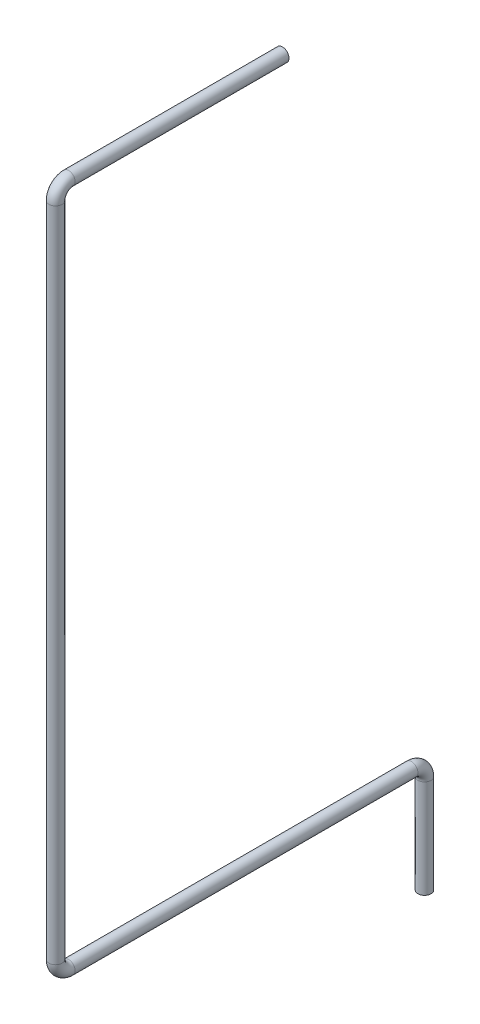
ISO-10303-21;
HEADER;
FILE_DESCRIPTION(('STEP AP214'),'2;1');
FILE_NAME('part.step','',(''),(''),'','','');
FILE_SCHEMA(('AUTOMOTIVE_DESIGN { 1 0 10303 214 1 1 1 1 }'));
ENDSEC;
DATA;
#1=APPLICATION_CONTEXT('core data for automotive mechanical design processes');
#2=APPLICATION_PROTOCOL_DEFINITION('international standard','automotive_design',2000,#1);
#3=PRODUCT_CONTEXT('',#1,'mechanical');
#4=PRODUCT('Part','Part','',(#3));
#5=PRODUCT_RELATED_PRODUCT_CATEGORY('part','',(#4));
#6=PRODUCT_DEFINITION_FORMATION('','',#4);
#7=PRODUCT_DEFINITION_CONTEXT('part definition',#1,'design');
#8=PRODUCT_DEFINITION('design','',#6,#7);
#9=PRODUCT_DEFINITION_SHAPE('','',#8);
#10=(LENGTH_UNIT() NAMED_UNIT(*) SI_UNIT(.MILLI.,.METRE.));
#11=(NAMED_UNIT(*) PLANE_ANGLE_UNIT() SI_UNIT($,.RADIAN.));
#12=(NAMED_UNIT(*) SI_UNIT($,.STERADIAN.) SOLID_ANGLE_UNIT());
#13=UNCERTAINTY_MEASURE_WITH_UNIT(LENGTH_MEASURE(1.E-05),#10,'distance_accuracy_value','');
#14=(GEOMETRIC_REPRESENTATION_CONTEXT(3) GLOBAL_UNCERTAINTY_ASSIGNED_CONTEXT((#13)) GLOBAL_UNIT_ASSIGNED_CONTEXT((#10,
#11,#12)) REPRESENTATION_CONTEXT('',''));
#15=CARTESIAN_POINT('',(0.,0.,0.));
#16=DIRECTION('',(0.,0.,1.));
#17=DIRECTION('',(1.,0.,0.));
#18=AXIS2_PLACEMENT_3D('',#15,#16,#17);
#19=CARTESIAN_POINT('',(0.,0.,0.));
#20=DIRECTION('',(0.,0.,-1.));
#21=DIRECTION('',(0.,1.,0.));
#22=AXIS2_PLACEMENT_3D('',#19,#20,#21);
#23=PLANE('',#22);
#24=CARTESIAN_POINT('',(0.,0.,0.));
#25=DIRECTION('',(0.,0.,-1.));
#26=DIRECTION('',(0.,1.,0.));
#27=AXIS2_PLACEMENT_3D('',#24,#25,#26);
#28=CIRCLE('',#27,1.);
#29=CARTESIAN_POINT('',(0.,1.,0.));
#30=VERTEX_POINT('',#29);
#31=EDGE_CURVE('E79',#30,#30,#28,.T.);
#32=ORIENTED_EDGE('',*,*,#31,.T.);
#33=EDGE_LOOP('',(#32));
#34=FACE_BOUND('',#33,.T.);
#35=ADVANCED_FACE('F51',(#34),#23,.T.);
#36=CARTESIAN_POINT('',(0.,-121.36,-21.69));
#37=DIRECTION('',(0.,1.,0.));
#38=DIRECTION('',(0.,0.,1.));
#39=AXIS2_PLACEMENT_3D('',#36,#37,#38);
#40=PLANE('',#39);
#41=CARTESIAN_POINT('',(0.,-121.36,-21.69));
#42=DIRECTION('',(0.,1.,0.));
#43=DIRECTION('',(0.,0.,1.));
#44=AXIS2_PLACEMENT_3D('',#41,#42,#43);
#45=CIRCLE('',#44,1.);
#46=CARTESIAN_POINT('',(0.,-121.36,-20.69));
#47=VERTEX_POINT('',#46);
#48=EDGE_CURVE('E11',#47,#47,#45,.T.);
#49=ORIENTED_EDGE('',*,*,#48,.F.);
#50=EDGE_LOOP('',(#49));
#51=FACE_BOUND('',#50,.T.);
#52=ADVANCED_FACE('F87',(#51),#40,.F.);
#53=CARTESIAN_POINT('',(0.,0.,0.));
#54=DIRECTION('',(0.,0.,1.));
#55=DIRECTION('',(0.,-1.,0.));
#56=AXIS2_PLACEMENT_3D('',#53,#54,#55);
#57=CYLINDRICAL_SURFACE('',#56,1.);
#58=CARTESIAN_POINT('',(0.,0.,32.66));
#59=DIRECTION('',(0.,0.,-1.));
#60=DIRECTION('',(0.,1.,0.));
#61=AXIS2_PLACEMENT_3D('',#58,#59,#60);
#62=CIRCLE('',#61,1.);
#63=CARTESIAN_POINT('',(0.,0.999999999999997,32.66));
#64=VERTEX_POINT('',#63);
#65=EDGE_CURVE('E76',#64,#64,#62,.T.);
#66=ORIENTED_EDGE('',*,*,#65,.T.);
#67=EDGE_LOOP('',(#66));
#68=FACE_BOUND('',#67,.T.);
#69=ORIENTED_EDGE('',*,*,#31,.F.);
#70=EDGE_LOOP('',(#69));
#71=FACE_BOUND('',#70,.T.);
#72=ADVANCED_FACE('F84',(#68,#71),#57,.T.);
#73=CARTESIAN_POINT('',(0.,-2.,32.66));
#74=DIRECTION('',(1.,0.,0.));
#75=DIRECTION('',(0.,0.,-1.));
#76=AXIS2_PLACEMENT_3D('',#73,#74,#75);
#77=TOROIDAL_SURFACE('',#76,2.,1.);
#78=CARTESIAN_POINT('',(0.,-2.,34.66));
#79=DIRECTION('',(0.,1.,0.));
#80=DIRECTION('',(0.,0.,1.));
#81=AXIS2_PLACEMENT_3D('',#78,#79,#80);
#82=CIRCLE('',#81,1.);
#83=CARTESIAN_POINT('',(0.,-2.,35.66));
#84=VERTEX_POINT('',#83);
#85=EDGE_CURVE('E73',#84,#84,#82,.T.);
#86=CARTESIAN_POINT('',(0.,-2.,32.66));
#87=DIRECTION('',(1.,0.,0.));
#88=DIRECTION('',(0.,0.,-1.));
#89=AXIS2_PLACEMENT_3D('',#86,#87,#88);
#90=CIRCLE('',#89,3.);
#91=EDGE_CURVE('',#64,#84,#90,.T.);
#92=ORIENTED_EDGE('',*,*,#65,.F.);
#93=ORIENTED_EDGE('',*,*,#85,.T.);
#94=ORIENTED_EDGE('',*,*,#91,.T.);
#95=ORIENTED_EDGE('',*,*,#91,.F.);
#96=EDGE_LOOP('',(#92,#94,#93,#95));
#97=FACE_BOUND('',#96,.T.);
#98=ADVANCED_FACE('F86',(#97),#77,.T.);
#99=CARTESIAN_POINT('',(0.,-2.00000000000002,34.66));
#100=DIRECTION('',(0.,-1.,0.));
#101=DIRECTION('',(0.,0.,-1.));
#102=AXIS2_PLACEMENT_3D('',#99,#100,#101);
#103=CYLINDRICAL_SURFACE('',#102,1.);
#104=CARTESIAN_POINT('',(0.,-102.36,34.66));
#105=DIRECTION('',(0.,1.,0.));
#106=DIRECTION('',(0.,0.,1.));
#107=AXIS2_PLACEMENT_3D('',#104,#105,#106);
#108=CIRCLE('',#107,1.);
#109=CARTESIAN_POINT('',(0.,-102.36,35.6599999999991));
#110=VERTEX_POINT('',#109);
#111=EDGE_CURVE('E70',#110,#110,#108,.T.);
#112=ORIENTED_EDGE('',*,*,#111,.T.);
#113=EDGE_LOOP('',(#112));
#114=FACE_BOUND('',#113,.T.);
#115=ORIENTED_EDGE('',*,*,#85,.F.);
#116=EDGE_LOOP('',(#115));
#117=FACE_BOUND('',#116,.T.);
#118=ADVANCED_FACE('F94',(#114,#117),#103,.T.);
#119=CARTESIAN_POINT('',(0.,-102.36,32.66));
#120=DIRECTION('',(1.,0.,0.));
#121=DIRECTION('',(0.,0.,-1.));
#122=AXIS2_PLACEMENT_3D('',#119,#120,#121);
#123=TOROIDAL_SURFACE('',#122,1.99999999999913,1.);
#124=CARTESIAN_POINT('',(0.,-104.36,32.66));
#125=DIRECTION('',(0.,0.,1.));
#126=DIRECTION('',(0.,-1.,0.));
#127=AXIS2_PLACEMENT_3D('',#124,#125,#126);
#128=CIRCLE('',#127,1.);
#129=CARTESIAN_POINT('',(0.,-105.359999999999,32.6599999999999));
#130=VERTEX_POINT('',#129);
#131=EDGE_CURVE('E65',#130,#130,#128,.T.);
#132=CARTESIAN_POINT('',(0.,-102.36,32.66));
#133=DIRECTION('',(1.,0.,0.));
#134=DIRECTION('',(0.,0.,-1.));
#135=AXIS2_PLACEMENT_3D('',#132,#133,#134);
#136=CIRCLE('',#135,2.99999999999913);
#137=EDGE_CURVE('',#110,#130,#136,.T.);
#138=ORIENTED_EDGE('',*,*,#111,.F.);
#139=ORIENTED_EDGE('',*,*,#131,.T.);
#140=ORIENTED_EDGE('',*,*,#137,.T.);
#141=ORIENTED_EDGE('',*,*,#137,.F.);
#142=EDGE_LOOP('',(#138,#140,#139,#141));
#143=FACE_BOUND('',#142,.T.);
#144=ADVANCED_FACE('F111',(#143),#123,.T.);
#145=CARTESIAN_POINT('',(0.,-104.36,32.66));
#146=DIRECTION('',(0.,0.,-1.));
#147=DIRECTION('',(-1.,0.,0.));
#148=AXIS2_PLACEMENT_3D('',#145,#146,#147);
#149=CYLINDRICAL_SURFACE('',#148,1.);
#150=CARTESIAN_POINT('',(0.,-104.36,-19.69));
#151=DIRECTION('',(0.,0.,1.));
#152=DIRECTION('',(0.,-1.,0.));
#153=AXIS2_PLACEMENT_3D('',#150,#151,#152);
#154=CIRCLE('',#153,1.);
#155=CARTESIAN_POINT('',(0.,-103.36,-19.69));
#156=VERTEX_POINT('',#155);
#157=EDGE_CURVE('E61',#156,#156,#154,.T.);
#158=ORIENTED_EDGE('',*,*,#157,.T.);
#159=EDGE_LOOP('',(#158));
#160=FACE_BOUND('',#159,.T.);
#161=ORIENTED_EDGE('',*,*,#131,.F.);
#162=EDGE_LOOP('',(#161));
#163=FACE_BOUND('',#162,.T.);
#164=ADVANCED_FACE('F105',(#160,#163),#149,.T.);
#165=CARTESIAN_POINT('',(0.,-106.36,-19.69));
#166=DIRECTION('',(-1.,0.,0.));
#167=DIRECTION('',(0.,0.,1.));
#168=AXIS2_PLACEMENT_3D('',#165,#166,#167);
#169=TOROIDAL_SURFACE('',#168,2.,1.);
#170=CARTESIAN_POINT('',(0.,-106.36,-21.6900000000001));
#171=DIRECTION('',(0.,1.,0.));
#172=DIRECTION('',(0.,0.,1.));
#173=AXIS2_PLACEMENT_3D('',#170,#171,#172);
#174=CIRCLE('',#173,1.);
#175=CARTESIAN_POINT('',(0.,-106.36,-22.69));
#176=VERTEX_POINT('',#175);
#177=EDGE_CURVE('E57',#176,#176,#174,.T.);
#178=CARTESIAN_POINT('',(0.,-106.36,-19.69));
#179=DIRECTION('',(-1.,0.,0.));
#180=DIRECTION('',(0.,0.,1.));
#181=AXIS2_PLACEMENT_3D('',#178,#179,#180);
#182=CIRCLE('',#181,3.);
#183=EDGE_CURVE('',#156,#176,#182,.T.);
#184=ORIENTED_EDGE('',*,*,#157,.F.);
#185=ORIENTED_EDGE('',*,*,#177,.T.);
#186=ORIENTED_EDGE('',*,*,#183,.T.);
#187=ORIENTED_EDGE('',*,*,#183,.F.);
#188=EDGE_LOOP('',(#184,#186,#185,#187));
#189=FACE_BOUND('',#188,.T.);
#190=ADVANCED_FACE('F100',(#189),#169,.T.);
#191=CARTESIAN_POINT('',(0.,-106.36,-21.69));
#192=DIRECTION('',(0.,-1.,0.));
#193=DIRECTION('',(0.,0.,-1.));
#194=AXIS2_PLACEMENT_3D('',#191,#192,#193);
#195=CYLINDRICAL_SURFACE('',#194,1.);
#196=ORIENTED_EDGE('',*,*,#48,.T.);
#197=EDGE_LOOP('',(#196));
#198=FACE_BOUND('',#197,.T.);
#199=ORIENTED_EDGE('',*,*,#177,.F.);
#200=EDGE_LOOP('',(#199));
#201=FACE_BOUND('',#200,.T.);
#202=ADVANCED_FACE('F98',(#198,#201),#195,.T.);
#203=CLOSED_SHELL('',(#35,#52,#72,#98,#118,#144,#164,#190,#202));
#204=MANIFOLD_SOLID_BREP('B2',#203);
#205=ADVANCED_BREP_SHAPE_REPRESENTATION('',(#18,#204),#14);
#206=SHAPE_DEFINITION_REPRESENTATION(#9,#205);
ENDSEC;
END-ISO-10303-21;
